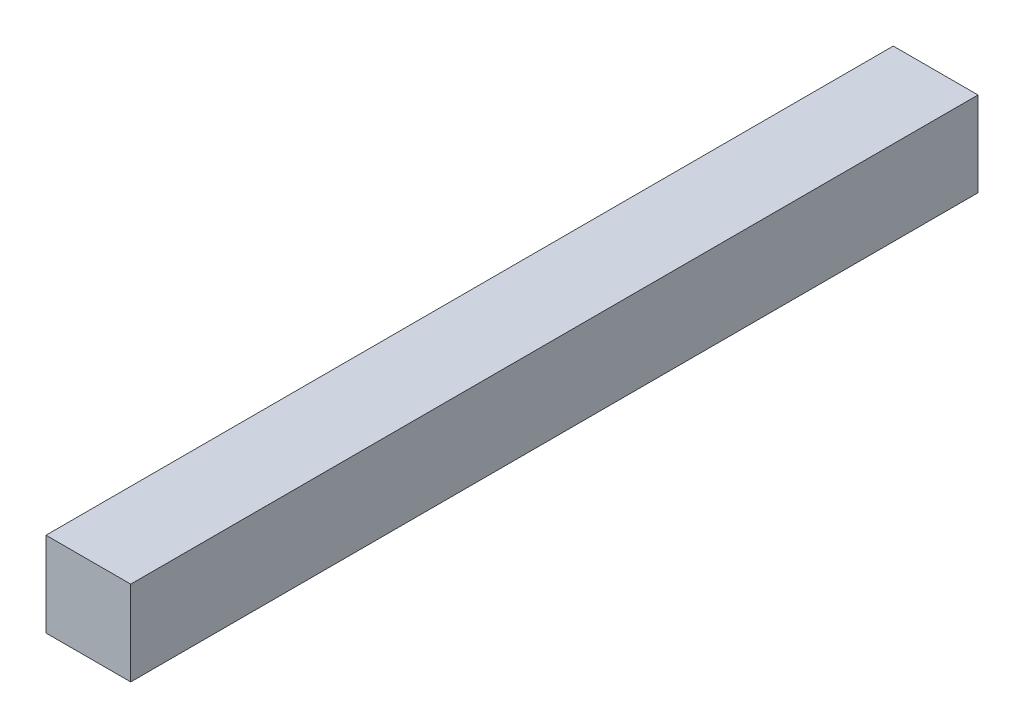
ISO-10303-21;
HEADER;
FILE_DESCRIPTION(('STEP AP214'),'2;1');
FILE_NAME('part.step','',(''),(''),'','','');
FILE_SCHEMA(('AUTOMOTIVE_DESIGN { 1 0 10303 214 1 1 1 1 }'));
ENDSEC;
DATA;
#1=APPLICATION_CONTEXT('core data for automotive mechanical design processes');
#2=APPLICATION_PROTOCOL_DEFINITION('international standard','automotive_design',2000,#1);
#3=PRODUCT_CONTEXT('',#1,'mechanical');
#4=PRODUCT('Part','Part','',(#3));
#5=PRODUCT_RELATED_PRODUCT_CATEGORY('part','',(#4));
#6=PRODUCT_DEFINITION_FORMATION('','',#4);
#7=PRODUCT_DEFINITION_CONTEXT('part definition',#1,'design');
#8=PRODUCT_DEFINITION('design','',#6,#7);
#9=PRODUCT_DEFINITION_SHAPE('','',#8);
#10=(LENGTH_UNIT() NAMED_UNIT(*) SI_UNIT(.MILLI.,.METRE.));
#11=(NAMED_UNIT(*) PLANE_ANGLE_UNIT() SI_UNIT($,.RADIAN.));
#12=(NAMED_UNIT(*) SI_UNIT($,.STERADIAN.) SOLID_ANGLE_UNIT());
#13=UNCERTAINTY_MEASURE_WITH_UNIT(LENGTH_MEASURE(1.E-05),#10,'distance_accuracy_value','');
#14=(GEOMETRIC_REPRESENTATION_CONTEXT(3) GLOBAL_UNCERTAINTY_ASSIGNED_CONTEXT((#13)) GLOBAL_UNIT_ASSIGNED_CONTEXT((#10,
#11,#12)) REPRESENTATION_CONTEXT('',''));
#15=CARTESIAN_POINT('',(0.,0.,0.));
#16=DIRECTION('',(0.,0.,1.));
#17=DIRECTION('',(1.,0.,0.));
#18=AXIS2_PLACEMENT_3D('',#15,#16,#17);
#19=CARTESIAN_POINT('',(0.,0.,200.));
#20=DIRECTION('',(1.,0.,0.));
#21=DIRECTION('',(0.,0.,-1.));
#22=AXIS2_PLACEMENT_3D('',#19,#20,#21);
#23=PLANE('',#22);
#24=DIRECTION('',(0.,-1.,0.));
#25=VECTOR('',#24,1.);
#26=CARTESIAN_POINT('',(0.,0.,0.));
#27=LINE('',#26,#25);
#28=CARTESIAN_POINT('',(0.,0.,0.));
#29=VERTEX_POINT('',#28);
#30=CARTESIAN_POINT('',(0.,-20.,0.));
#31=VERTEX_POINT('',#30);
#32=EDGE_CURVE('E96',#29,#31,#27,.T.);
#33=ORIENTED_EDGE('',*,*,#32,.T.);
#34=DIRECTION('',(0.,0.,-1.));
#35=VECTOR('',#34,1.);
#36=CARTESIAN_POINT('',(0.,-20.,200.));
#37=LINE('',#36,#35);
#38=CARTESIAN_POINT('',(0.,-20.,200.));
#39=VERTEX_POINT('',#38);
#40=EDGE_CURVE('E11',#39,#31,#37,.T.);
#41=ORIENTED_EDGE('',*,*,#40,.F.);
#42=DIRECTION('',(0.,-1.,0.));
#43=VECTOR('',#42,1.);
#44=CARTESIAN_POINT('',(0.,0.,200.));
#45=LINE('',#44,#43);
#46=CARTESIAN_POINT('',(0.,0.,200.));
#47=VERTEX_POINT('',#46);
#48=EDGE_CURVE('E84',#47,#39,#45,.T.);
#49=ORIENTED_EDGE('',*,*,#48,.F.);
#50=DIRECTION('',(0.,0.,-1.));
#51=VECTOR('',#50,1.);
#52=CARTESIAN_POINT('',(0.,0.,200.));
#53=LINE('',#52,#51);
#54=EDGE_CURVE('E92',#47,#29,#53,.T.);
#55=ORIENTED_EDGE('',*,*,#54,.T.);
#56=EDGE_LOOP('',(#33,#41,#49,#55));
#57=FACE_BOUND('',#56,.T.);
#58=ADVANCED_FACE('F33',(#57),#23,.F.);
#59=CARTESIAN_POINT('',(0.,-20.,200.));
#60=DIRECTION('',(0.,1.,0.));
#61=DIRECTION('',(0.,0.,1.));
#62=AXIS2_PLACEMENT_3D('',#59,#60,#61);
#63=PLANE('',#62);
#64=DIRECTION('',(1.,0.,0.));
#65=VECTOR('',#64,1.);
#66=CARTESIAN_POINT('',(0.,-20.,0.));
#67=LINE('',#66,#65);
#68=CARTESIAN_POINT('',(20.,-20.,0.));
#69=VERTEX_POINT('',#68);
#70=EDGE_CURVE('E88',#31,#69,#67,.T.);
#71=ORIENTED_EDGE('',*,*,#70,.T.);
#72=DIRECTION('',(0.,0.,-1.));
#73=VECTOR('',#72,1.);
#74=CARTESIAN_POINT('',(20.,-20.,200.));
#75=LINE('',#74,#73);
#76=CARTESIAN_POINT('',(20.,-20.,200.));
#77=VERTEX_POINT('',#76);
#78=EDGE_CURVE('E41',#77,#69,#75,.T.);
#79=ORIENTED_EDGE('',*,*,#78,.F.);
#80=DIRECTION('',(1.,0.,0.));
#81=VECTOR('',#80,1.);
#82=CARTESIAN_POINT('',(0.,-20.,200.));
#83=LINE('',#82,#81);
#84=EDGE_CURVE('E79',#39,#77,#83,.T.);
#85=ORIENTED_EDGE('',*,*,#84,.F.);
#86=ORIENTED_EDGE('',*,*,#40,.T.);
#87=EDGE_LOOP('',(#71,#79,#85,#86));
#88=FACE_BOUND('',#87,.T.);
#89=ADVANCED_FACE('F87',(#88),#63,.F.);
#90=CARTESIAN_POINT('',(20.,0.,200.));
#91=DIRECTION('',(-1.,0.,0.));
#92=DIRECTION('',(0.,0.,1.));
#93=AXIS2_PLACEMENT_3D('',#90,#91,#92);
#94=PLANE('',#93);
#95=DIRECTION('',(0.,1.,0.));
#96=VECTOR('',#95,1.);
#97=CARTESIAN_POINT('',(20.,0.,0.));
#98=LINE('',#97,#96);
#99=CARTESIAN_POINT('',(20.,0.,0.));
#100=VERTEX_POINT('',#99);
#101=EDGE_CURVE('E66',#69,#100,#98,.T.);
#102=ORIENTED_EDGE('',*,*,#101,.T.);
#103=DIRECTION('',(0.,0.,-1.));
#104=VECTOR('',#103,1.);
#105=CARTESIAN_POINT('',(20.,0.,200.));
#106=LINE('',#105,#104);
#107=CARTESIAN_POINT('',(20.,0.,200.));
#108=VERTEX_POINT('',#107);
#109=EDGE_CURVE('E89',#108,#100,#106,.T.);
#110=ORIENTED_EDGE('',*,*,#109,.F.);
#111=DIRECTION('',(0.,1.,0.));
#112=VECTOR('',#111,1.);
#113=CARTESIAN_POINT('',(20.,0.,200.));
#114=LINE('',#113,#112);
#115=EDGE_CURVE('E82',#77,#108,#114,.T.);
#116=ORIENTED_EDGE('',*,*,#115,.F.);
#117=ORIENTED_EDGE('',*,*,#78,.T.);
#118=EDGE_LOOP('',(#102,#110,#116,#117));
#119=FACE_BOUND('',#118,.T.);
#120=ADVANCED_FACE('F90',(#119),#94,.F.);
#121=CARTESIAN_POINT('',(0.,0.,200.));
#122=DIRECTION('',(0.,-1.,0.));
#123=DIRECTION('',(0.,0.,-1.));
#124=AXIS2_PLACEMENT_3D('',#121,#122,#123);
#125=PLANE('',#124);
#126=DIRECTION('',(-1.,0.,0.));
#127=VECTOR('',#126,1.);
#128=CARTESIAN_POINT('',(0.,0.,0.));
#129=LINE('',#128,#127);
#130=EDGE_CURVE('E72',#100,#29,#129,.T.);
#131=ORIENTED_EDGE('',*,*,#130,.T.);
#132=ORIENTED_EDGE('',*,*,#54,.F.);
#133=DIRECTION('',(-1.,0.,0.));
#134=VECTOR('',#133,1.);
#135=CARTESIAN_POINT('',(0.,0.,200.));
#136=LINE('',#135,#134);
#137=EDGE_CURVE('E49',#108,#47,#136,.T.);
#138=ORIENTED_EDGE('',*,*,#137,.F.);
#139=ORIENTED_EDGE('',*,*,#109,.T.);
#140=EDGE_LOOP('',(#131,#132,#138,#139));
#141=FACE_BOUND('',#140,.T.);
#142=ADVANCED_FACE('F103',(#141),#125,.F.);
#143=CARTESIAN_POINT('',(0.,0.,200.));
#144=DIRECTION('',(0.,0.,1.));
#145=DIRECTION('',(1.,0.,0.));
#146=AXIS2_PLACEMENT_3D('',#143,#144,#145);
#147=PLANE('',#146);
#148=ORIENTED_EDGE('',*,*,#48,.T.);
#149=ORIENTED_EDGE('',*,*,#84,.T.);
#150=ORIENTED_EDGE('',*,*,#115,.T.);
#151=ORIENTED_EDGE('',*,*,#137,.T.);
#152=EDGE_LOOP('',(#148,#149,#150,#151));
#153=FACE_BOUND('',#152,.T.);
#154=ADVANCED_FACE('F80',(#153),#147,.T.);
#155=CARTESIAN_POINT('',(0.,0.,0.));
#156=DIRECTION('',(0.,0.,1.));
#157=DIRECTION('',(1.,0.,0.));
#158=AXIS2_PLACEMENT_3D('',#155,#156,#157);
#159=PLANE('',#158);
#160=ORIENTED_EDGE('',*,*,#32,.F.);
#161=ORIENTED_EDGE('',*,*,#130,.F.);
#162=ORIENTED_EDGE('',*,*,#101,.F.);
#163=ORIENTED_EDGE('',*,*,#70,.F.);
#164=EDGE_LOOP('',(#160,#161,#162,#163));
#165=FACE_BOUND('',#164,.T.);
#166=ADVANCED_FACE('F106',(#165),#159,.F.);
#167=CLOSED_SHELL('',(#58,#89,#120,#142,#154,#166));
#168=MANIFOLD_SOLID_BREP('B2',#167);
#169=ADVANCED_BREP_SHAPE_REPRESENTATION('',(#18,#168),#14);
#170=SHAPE_DEFINITION_REPRESENTATION(#9,#169);
ENDSEC;
END-ISO-10303-21;
